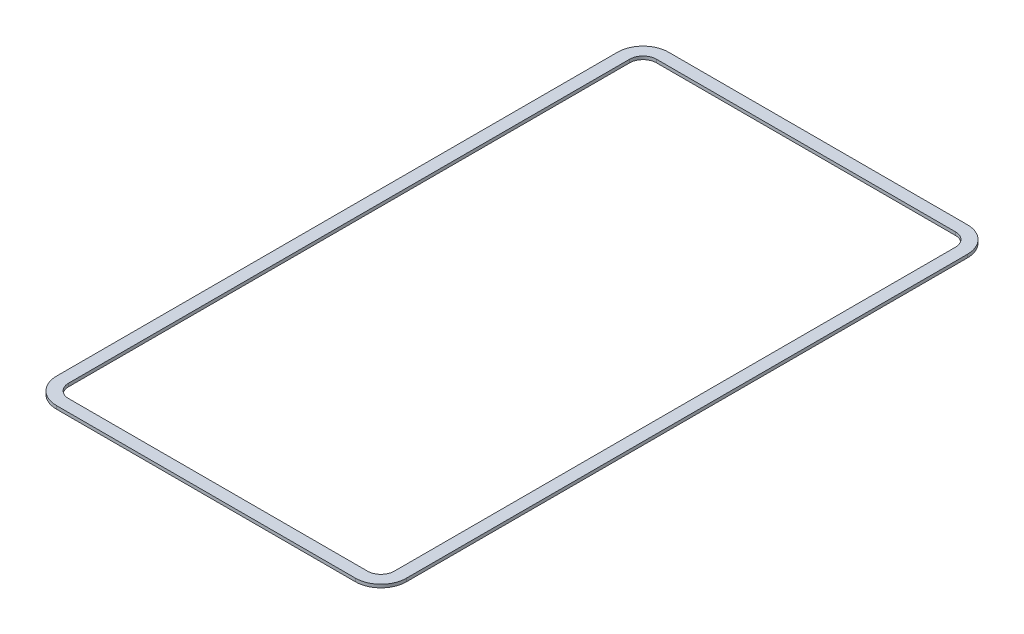
ISO-10303-21;
HEADER;
FILE_DESCRIPTION(('STEP AP214'),'2;1');
FILE_NAME('part.step','',(''),(''),'','','');
FILE_SCHEMA(('AUTOMOTIVE_DESIGN { 1 0 10303 214 1 1 1 1 }'));
ENDSEC;
DATA;
#1=APPLICATION_CONTEXT('core data for automotive mechanical design processes');
#2=APPLICATION_PROTOCOL_DEFINITION('international standard','automotive_design',2000,#1);
#3=PRODUCT_CONTEXT('',#1,'mechanical');
#4=PRODUCT('Part','Part','',(#3));
#5=PRODUCT_RELATED_PRODUCT_CATEGORY('part','',(#4));
#6=PRODUCT_DEFINITION_FORMATION('','',#4);
#7=PRODUCT_DEFINITION_CONTEXT('part definition',#1,'design');
#8=PRODUCT_DEFINITION('design','',#6,#7);
#9=PRODUCT_DEFINITION_SHAPE('','',#8);
#10=(LENGTH_UNIT() NAMED_UNIT(*) SI_UNIT(.MILLI.,.METRE.));
#11=(NAMED_UNIT(*) PLANE_ANGLE_UNIT() SI_UNIT($,.RADIAN.));
#12=(NAMED_UNIT(*) SI_UNIT($,.STERADIAN.) SOLID_ANGLE_UNIT());
#13=UNCERTAINTY_MEASURE_WITH_UNIT(LENGTH_MEASURE(1.E-05),#10,'distance_accuracy_value','');
#14=(GEOMETRIC_REPRESENTATION_CONTEXT(3) GLOBAL_UNCERTAINTY_ASSIGNED_CONTEXT((#13)) GLOBAL_UNIT_ASSIGNED_CONTEXT((#10,
#11,#12)) REPRESENTATION_CONTEXT('',''));
#15=CARTESIAN_POINT('',(0.,0.,0.));
#16=DIRECTION('',(0.,0.,1.));
#17=DIRECTION('',(1.,0.,0.));
#18=AXIS2_PLACEMENT_3D('',#15,#16,#17);
#19=CARTESIAN_POINT('',(-129.206151025171,0.5,16.495682613769));
#20=DIRECTION('',(0.,1.,0.));
#21=DIRECTION('',(0.,0.,1.));
#22=AXIS2_PLACEMENT_3D('',#19,#20,#21);
#23=PLANE('',#22);
#24=CARTESIAN_POINT('',(-129.206151025171,0.5,16.495682613769));
#25=DIRECTION('',(0.,1.,0.));
#26=DIRECTION('',(0.,0.,1.));
#27=AXIS2_PLACEMENT_3D('',#24,#25,#26);
#28=CIRCLE('',#27,4.);
#29=CARTESIAN_POINT('',(-133.206151025171,0.5,16.495682613769));
#30=VERTEX_POINT('',#29);
#31=CARTESIAN_POINT('',(-129.206151025171,0.5,20.495682613769));
#32=VERTEX_POINT('',#31);
#33=EDGE_CURVE('E217',#30,#32,#28,.T.);
#34=ORIENTED_EDGE('',*,*,#33,.T.);
#35=DIRECTION('',(1.,0.,0.));
#36=VECTOR('',#35,1.);
#37=CARTESIAN_POINT('',(-129.206151025171,0.5,20.495682613769));
#38=LINE('',#37,#36);
#39=CARTESIAN_POINT('',(-82.3199233679222,0.5,20.495682613769));
#40=VERTEX_POINT('',#39);
#41=EDGE_CURVE('E220',#32,#40,#38,.T.);
#42=ORIENTED_EDGE('',*,*,#41,.T.);
#43=CARTESIAN_POINT('',(-82.3199233679222,0.5,16.495682613769));
#44=DIRECTION('',(0.,1.,0.));
#45=DIRECTION('',(0.,0.,1.));
#46=AXIS2_PLACEMENT_3D('',#43,#44,#45);
#47=CIRCLE('',#46,3.99999999999999);
#48=CARTESIAN_POINT('',(-78.3199233679222,0.5,16.495682613769));
#49=VERTEX_POINT('',#48);
#50=EDGE_CURVE('E223',#40,#49,#47,.T.);
#51=ORIENTED_EDGE('',*,*,#50,.T.);
#52=DIRECTION('',(0.,0.,-1.));
#53=VECTOR('',#52,1.);
#54=CARTESIAN_POINT('',(-78.3199233679222,0.5,-71.5043173862311));
#55=LINE('',#54,#53);
#56=CARTESIAN_POINT('',(-78.3199233679222,0.5,-71.5043173862311));
#57=VERTEX_POINT('',#56);
#58=EDGE_CURVE('E225',#49,#57,#55,.T.);
#59=ORIENTED_EDGE('',*,*,#58,.T.);
#60=CARTESIAN_POINT('',(-82.3199233679222,0.5,-71.5043173862311));
#61=DIRECTION('',(0.,1.,0.));
#62=DIRECTION('',(0.,0.,-1.));
#63=AXIS2_PLACEMENT_3D('',#60,#61,#62);
#64=CIRCLE('',#63,4.);
#65=CARTESIAN_POINT('',(-82.3199233679222,0.5,-75.5043173862311));
#66=VERTEX_POINT('',#65);
#67=EDGE_CURVE('E227',#57,#66,#64,.T.);
#68=ORIENTED_EDGE('',*,*,#67,.T.);
#69=DIRECTION('',(-1.,0.,0.));
#70=VECTOR('',#69,1.);
#71=CARTESIAN_POINT('',(-129.206151025171,0.5,-75.5043173862311));
#72=LINE('',#71,#70);
#73=CARTESIAN_POINT('',(-129.206151025171,0.5,-75.5043173862311));
#74=VERTEX_POINT('',#73);
#75=EDGE_CURVE('E229',#66,#74,#72,.T.);
#76=ORIENTED_EDGE('',*,*,#75,.T.);
#77=CARTESIAN_POINT('',(-129.206151025171,0.5,-71.5043173862311));
#78=DIRECTION('',(0.,1.,0.));
#79=DIRECTION('',(0.,0.,1.));
#80=AXIS2_PLACEMENT_3D('',#77,#78,#79);
#81=CIRCLE('',#80,4.);
#82=CARTESIAN_POINT('',(-133.206151025171,0.5,-71.5043173862311));
#83=VERTEX_POINT('',#82);
#84=EDGE_CURVE('E231',#74,#83,#81,.T.);
#85=ORIENTED_EDGE('',*,*,#84,.T.);
#86=DIRECTION('',(0.,0.,1.));
#87=VECTOR('',#86,1.);
#88=CARTESIAN_POINT('',(-133.206151025171,0.5,-71.5043173862311));
#89=LINE('',#88,#87);
#90=EDGE_CURVE('E233',#83,#30,#89,.T.);
#91=ORIENTED_EDGE('',*,*,#90,.T.);
#92=EDGE_LOOP('',(#34,#42,#51,#59,#68,#76,#85,#91));
#93=FACE_BOUND('',#92,.T.);
#94=DIRECTION('',(0.,0.,1.));
#95=VECTOR('',#94,1.);
#96=CARTESIAN_POINT('',(-131.306151025171,0.5,-71.5043173862311));
#97=LINE('',#96,#95);
#98=CARTESIAN_POINT('',(-131.306151025171,0.5,-71.5043173862311));
#99=VERTEX_POINT('',#98);
#100=CARTESIAN_POINT('',(-131.306151025171,0.5,16.495682613769));
#101=VERTEX_POINT('',#100);
#102=EDGE_CURVE('E160',#99,#101,#97,.T.);
#103=ORIENTED_EDGE('',*,*,#102,.F.);
#104=CARTESIAN_POINT('',(-129.206151025171,0.5,-71.5043173862311));
#105=DIRECTION('',(0.,1.,0.));
#106=DIRECTION('',(0.,0.,1.));
#107=AXIS2_PLACEMENT_3D('',#104,#105,#106);
#108=CIRCLE('',#107,2.1);
#109=CARTESIAN_POINT('',(-129.206151025171,0.5,-73.604317386231));
#110=VERTEX_POINT('',#109);
#111=EDGE_CURVE('E152',#110,#99,#108,.T.);
#112=ORIENTED_EDGE('',*,*,#111,.F.);
#113=DIRECTION('',(-1.,0.,0.));
#114=VECTOR('',#113,1.);
#115=CARTESIAN_POINT('',(-129.206151025171,0.5,-73.604317386231));
#116=LINE('',#115,#114);
#117=CARTESIAN_POINT('',(-82.3199233679222,0.5,-73.604317386231));
#118=VERTEX_POINT('',#117);
#119=EDGE_CURVE('E185',#118,#110,#116,.T.);
#120=ORIENTED_EDGE('',*,*,#119,.F.);
#121=CARTESIAN_POINT('',(-82.3199233679222,0.5,-71.5043173862311));
#122=DIRECTION('',(0.,1.,0.));
#123=DIRECTION('',(0.,0.,-1.));
#124=AXIS2_PLACEMENT_3D('',#121,#122,#123);
#125=CIRCLE('',#124,2.09999999999999);
#126=CARTESIAN_POINT('',(-80.2199233679222,0.5,-71.5043173862311));
#127=VERTEX_POINT('',#126);
#128=EDGE_CURVE('E183',#127,#118,#125,.T.);
#129=ORIENTED_EDGE('',*,*,#128,.F.);
#130=DIRECTION('',(0.,0.,-1.));
#131=VECTOR('',#130,1.);
#132=CARTESIAN_POINT('',(-80.2199233679222,0.5,-71.5043173862311));
#133=LINE('',#132,#131);
#134=CARTESIAN_POINT('',(-80.2199233679222,0.5,16.495682613769));
#135=VERTEX_POINT('',#134);
#136=EDGE_CURVE('E181',#135,#127,#133,.T.);
#137=ORIENTED_EDGE('',*,*,#136,.F.);
#138=CARTESIAN_POINT('',(-82.3199233679222,0.5,16.495682613769));
#139=DIRECTION('',(0.,1.,0.));
#140=DIRECTION('',(0.,0.,1.));
#141=AXIS2_PLACEMENT_3D('',#138,#139,#140);
#142=CIRCLE('',#141,2.09999999999999);
#143=CARTESIAN_POINT('',(-82.3199233679222,0.5,18.595682613769));
#144=VERTEX_POINT('',#143);
#145=EDGE_CURVE('E179',#144,#135,#142,.T.);
#146=ORIENTED_EDGE('',*,*,#145,.F.);
#147=DIRECTION('',(1.,0.,0.));
#148=VECTOR('',#147,1.);
#149=CARTESIAN_POINT('',(-129.206151025171,0.5,18.595682613769));
#150=LINE('',#149,#148);
#151=CARTESIAN_POINT('',(-129.206151025171,0.5,18.595682613769));
#152=VERTEX_POINT('',#151);
#153=EDGE_CURVE('E175',#152,#144,#150,.T.);
#154=ORIENTED_EDGE('',*,*,#153,.F.);
#155=CARTESIAN_POINT('',(-129.206151025171,0.5,16.495682613769));
#156=DIRECTION('',(0.,1.,0.));
#157=DIRECTION('',(0.,0.,1.));
#158=AXIS2_PLACEMENT_3D('',#155,#156,#157);
#159=CIRCLE('',#158,2.10000000000001);
#160=EDGE_CURVE('E173',#101,#152,#159,.T.);
#161=ORIENTED_EDGE('',*,*,#160,.F.);
#162=EDGE_LOOP('',(#103,#112,#120,#129,#137,#146,#154,#161));
#163=FACE_BOUND('',#162,.T.);
#164=ADVANCED_FACE('F39',(#93,#163),#23,.T.);
#165=CARTESIAN_POINT('',(-129.206151025171,0.,16.495682613769));
#166=DIRECTION('',(0.,1.,0.));
#167=DIRECTION('',(0.,0.,1.));
#168=AXIS2_PLACEMENT_3D('',#165,#166,#167);
#169=PLANE('',#168);
#170=CARTESIAN_POINT('',(-129.206151025171,0.,16.495682613769));
#171=DIRECTION('',(0.,1.,0.));
#172=DIRECTION('',(0.,0.,1.));
#173=AXIS2_PLACEMENT_3D('',#170,#171,#172);
#174=CIRCLE('',#173,4.);
#175=CARTESIAN_POINT('',(-133.206151025171,0.,16.495682613769));
#176=VERTEX_POINT('',#175);
#177=CARTESIAN_POINT('',(-129.206151025171,0.,20.495682613769));
#178=VERTEX_POINT('',#177);
#179=EDGE_CURVE('E168',#176,#178,#174,.T.);
#180=ORIENTED_EDGE('',*,*,#179,.F.);
#181=DIRECTION('',(0.,0.,1.));
#182=VECTOR('',#181,1.);
#183=CARTESIAN_POINT('',(-133.206151025171,0.,-71.5043173862311));
#184=LINE('',#183,#182);
#185=CARTESIAN_POINT('',(-133.206151025171,0.,-71.5043173862311));
#186=VERTEX_POINT('',#185);
#187=EDGE_CURVE('E221',#186,#176,#184,.T.);
#188=ORIENTED_EDGE('',*,*,#187,.F.);
#189=CARTESIAN_POINT('',(-129.206151025171,0.,-71.5043173862311));
#190=DIRECTION('',(0.,1.,0.));
#191=DIRECTION('',(0.,0.,1.));
#192=AXIS2_PLACEMENT_3D('',#189,#190,#191);
#193=CIRCLE('',#192,4.);
#194=CARTESIAN_POINT('',(-129.206151025171,0.,-75.5043173862311));
#195=VERTEX_POINT('',#194);
#196=EDGE_CURVE('E248',#195,#186,#193,.T.);
#197=ORIENTED_EDGE('',*,*,#196,.F.);
#198=DIRECTION('',(-1.,0.,0.));
#199=VECTOR('',#198,1.);
#200=CARTESIAN_POINT('',(-129.206151025171,0.,-75.5043173862311));
#201=LINE('',#200,#199);
#202=CARTESIAN_POINT('',(-82.3199233679222,0.,-75.5043173862311));
#203=VERTEX_POINT('',#202);
#204=EDGE_CURVE('E246',#203,#195,#201,.T.);
#205=ORIENTED_EDGE('',*,*,#204,.F.);
#206=CARTESIAN_POINT('',(-82.3199233679222,0.,-71.5043173862311));
#207=DIRECTION('',(0.,1.,0.));
#208=DIRECTION('',(0.,0.,-1.));
#209=AXIS2_PLACEMENT_3D('',#206,#207,#208);
#210=CIRCLE('',#209,4.);
#211=CARTESIAN_POINT('',(-78.3199233679222,0.,-71.5043173862311));
#212=VERTEX_POINT('',#211);
#213=EDGE_CURVE('E244',#212,#203,#210,.T.);
#214=ORIENTED_EDGE('',*,*,#213,.F.);
#215=DIRECTION('',(0.,0.,-1.));
#216=VECTOR('',#215,1.);
#217=CARTESIAN_POINT('',(-78.3199233679222,0.,-71.5043173862311));
#218=LINE('',#217,#216);
#219=CARTESIAN_POINT('',(-78.3199233679222,0.,16.495682613769));
#220=VERTEX_POINT('',#219);
#221=EDGE_CURVE('E242',#220,#212,#218,.T.);
#222=ORIENTED_EDGE('',*,*,#221,.F.);
#223=CARTESIAN_POINT('',(-82.3199233679222,0.,16.495682613769));
#224=DIRECTION('',(0.,1.,0.));
#225=DIRECTION('',(0.,0.,1.));
#226=AXIS2_PLACEMENT_3D('',#223,#224,#225);
#227=CIRCLE('',#226,3.99999999999999);
#228=CARTESIAN_POINT('',(-82.3199233679222,0.,20.495682613769));
#229=VERTEX_POINT('',#228);
#230=EDGE_CURVE('E240',#229,#220,#227,.T.);
#231=ORIENTED_EDGE('',*,*,#230,.F.);
#232=DIRECTION('',(1.,0.,0.));
#233=VECTOR('',#232,1.);
#234=CARTESIAN_POINT('',(-129.206151025171,0.,20.495682613769));
#235=LINE('',#234,#233);
#236=EDGE_CURVE('E238',#178,#229,#235,.T.);
#237=ORIENTED_EDGE('',*,*,#236,.F.);
#238=EDGE_LOOP('',(#180,#188,#197,#205,#214,#222,#231,#237));
#239=FACE_BOUND('',#238,.T.);
#240=CARTESIAN_POINT('',(-129.206151025171,0.,-71.5043173862311));
#241=DIRECTION('',(0.,1.,0.));
#242=DIRECTION('',(0.,0.,1.));
#243=AXIS2_PLACEMENT_3D('',#240,#241,#242);
#244=CIRCLE('',#243,2.1);
#245=CARTESIAN_POINT('',(-129.206151025171,0.,-73.604317386231));
#246=VERTEX_POINT('',#245);
#247=CARTESIAN_POINT('',(-131.306151025171,0.,-71.5043173862311));
#248=VERTEX_POINT('',#247);
#249=EDGE_CURVE('E62',#246,#248,#244,.T.);
#250=ORIENTED_EDGE('',*,*,#249,.T.);
#251=DIRECTION('',(0.,0.,1.));
#252=VECTOR('',#251,1.);
#253=CARTESIAN_POINT('',(-131.306151025171,0.,-71.5043173862311));
#254=LINE('',#253,#252);
#255=CARTESIAN_POINT('',(-131.306151025171,0.,16.495682613769));
#256=VERTEX_POINT('',#255);
#257=EDGE_CURVE('E167',#248,#256,#254,.T.);
#258=ORIENTED_EDGE('',*,*,#257,.T.);
#259=CARTESIAN_POINT('',(-129.206151025171,0.,16.495682613769));
#260=DIRECTION('',(0.,1.,0.));
#261=DIRECTION('',(0.,0.,1.));
#262=AXIS2_PLACEMENT_3D('',#259,#260,#261);
#263=CIRCLE('',#262,2.10000000000001);
#264=CARTESIAN_POINT('',(-129.206151025171,0.,18.595682613769));
#265=VERTEX_POINT('',#264);
#266=EDGE_CURVE('E189',#256,#265,#263,.T.);
#267=ORIENTED_EDGE('',*,*,#266,.T.);
#268=DIRECTION('',(1.,0.,0.));
#269=VECTOR('',#268,1.);
#270=CARTESIAN_POINT('',(-129.206151025171,0.,18.595682613769));
#271=LINE('',#270,#269);
#272=CARTESIAN_POINT('',(-82.3199233679222,0.,18.595682613769));
#273=VERTEX_POINT('',#272);
#274=EDGE_CURVE('E192',#265,#273,#271,.T.);
#275=ORIENTED_EDGE('',*,*,#274,.T.);
#276=CARTESIAN_POINT('',(-82.3199233679222,0.,16.495682613769));
#277=DIRECTION('',(0.,1.,0.));
#278=DIRECTION('',(0.,0.,1.));
#279=AXIS2_PLACEMENT_3D('',#276,#277,#278);
#280=CIRCLE('',#279,2.09999999999999);
#281=CARTESIAN_POINT('',(-80.2199233679222,0.,16.495682613769));
#282=VERTEX_POINT('',#281);
#283=EDGE_CURVE('E195',#273,#282,#280,.T.);
#284=ORIENTED_EDGE('',*,*,#283,.T.);
#285=DIRECTION('',(0.,0.,-1.));
#286=VECTOR('',#285,1.);
#287=CARTESIAN_POINT('',(-80.2199233679222,0.,-71.5043173862311));
#288=LINE('',#287,#286);
#289=CARTESIAN_POINT('',(-80.2199233679222,0.,-71.5043173862311));
#290=VERTEX_POINT('',#289);
#291=EDGE_CURVE('E198',#282,#290,#288,.T.);
#292=ORIENTED_EDGE('',*,*,#291,.T.);
#293=CARTESIAN_POINT('',(-82.3199233679222,0.,-71.5043173862311));
#294=DIRECTION('',(0.,1.,0.));
#295=DIRECTION('',(0.,0.,-1.));
#296=AXIS2_PLACEMENT_3D('',#293,#294,#295);
#297=CIRCLE('',#296,2.09999999999999);
#298=CARTESIAN_POINT('',(-82.3199233679222,0.,-73.604317386231));
#299=VERTEX_POINT('',#298);
#300=EDGE_CURVE('E201',#290,#299,#297,.T.);
#301=ORIENTED_EDGE('',*,*,#300,.T.);
#302=DIRECTION('',(-1.,0.,0.));
#303=VECTOR('',#302,1.);
#304=CARTESIAN_POINT('',(-129.206151025171,0.,-73.604317386231));
#305=LINE('',#304,#303);
#306=EDGE_CURVE('E161',#299,#246,#305,.T.);
#307=ORIENTED_EDGE('',*,*,#306,.T.);
#308=EDGE_LOOP('',(#250,#258,#267,#275,#284,#292,#301,#307));
#309=FACE_BOUND('',#308,.T.);
#310=ADVANCED_FACE('F278',(#239,#309),#169,.F.);
#311=CARTESIAN_POINT('',(-129.206151025171,0.5,16.495682613769));
#312=DIRECTION('',(0.,-1.,0.));
#313=DIRECTION('',(0.,0.,-1.));
#314=AXIS2_PLACEMENT_3D('',#311,#312,#313);
#315=CYLINDRICAL_SURFACE('',#314,4.);
#316=ORIENTED_EDGE('',*,*,#179,.T.);
#317=DIRECTION('',(0.,-1.,0.));
#318=VECTOR('',#317,1.);
#319=CARTESIAN_POINT('',(-129.206151025171,0.5,20.495682613769));
#320=LINE('',#319,#318);
#321=EDGE_CURVE('E11',#32,#178,#320,.T.);
#322=ORIENTED_EDGE('',*,*,#321,.F.);
#323=ORIENTED_EDGE('',*,*,#33,.F.);
#324=DIRECTION('',(0.,-1.,0.));
#325=VECTOR('',#324,1.);
#326=CARTESIAN_POINT('',(-133.206151025171,0.5,16.495682613769));
#327=LINE('',#326,#325);
#328=EDGE_CURVE('E235',#30,#176,#327,.T.);
#329=ORIENTED_EDGE('',*,*,#328,.T.);
#330=EDGE_LOOP('',(#316,#322,#323,#329));
#331=FACE_BOUND('',#330,.T.);
#332=ADVANCED_FACE('F41',(#331),#315,.T.);
#333=CARTESIAN_POINT('',(-129.206151025171,0.5,20.495682613769));
#334=DIRECTION('',(0.,0.,-1.));
#335=DIRECTION('',(-1.,0.,0.));
#336=AXIS2_PLACEMENT_3D('',#333,#334,#335);
#337=PLANE('',#336);
#338=ORIENTED_EDGE('',*,*,#236,.T.);
#339=DIRECTION('',(0.,-1.,0.));
#340=VECTOR('',#339,1.);
#341=CARTESIAN_POINT('',(-82.3199233679222,0.5,20.495682613769));
#342=LINE('',#341,#340);
#343=EDGE_CURVE('E47',#40,#229,#342,.T.);
#344=ORIENTED_EDGE('',*,*,#343,.F.);
#345=ORIENTED_EDGE('',*,*,#41,.F.);
#346=ORIENTED_EDGE('',*,*,#321,.T.);
#347=EDGE_LOOP('',(#338,#344,#345,#346));
#348=FACE_BOUND('',#347,.T.);
#349=ADVANCED_FACE('F295',(#348),#337,.F.);
#350=CARTESIAN_POINT('',(-82.3199233679222,0.5,16.495682613769));
#351=DIRECTION('',(0.,-1.,0.));
#352=DIRECTION('',(0.,0.,-1.));
#353=AXIS2_PLACEMENT_3D('',#350,#351,#352);
#354=CYLINDRICAL_SURFACE('',#353,3.99999999999999);
#355=ORIENTED_EDGE('',*,*,#230,.T.);
#356=DIRECTION('',(0.,-1.,0.));
#357=VECTOR('',#356,1.);
#358=CARTESIAN_POINT('',(-78.3199233679222,0.5,16.495682613769));
#359=LINE('',#358,#357);
#360=EDGE_CURVE('E265',#49,#220,#359,.T.);
#361=ORIENTED_EDGE('',*,*,#360,.F.);
#362=ORIENTED_EDGE('',*,*,#50,.F.);
#363=ORIENTED_EDGE('',*,*,#343,.T.);
#364=EDGE_LOOP('',(#355,#361,#362,#363));
#365=FACE_BOUND('',#364,.T.);
#366=ADVANCED_FACE('F272',(#365),#354,.T.);
#367=CARTESIAN_POINT('',(-78.3199233679222,0.5,-71.5043173862311));
#368=DIRECTION('',(-1.,0.,0.));
#369=DIRECTION('',(0.,0.,1.));
#370=AXIS2_PLACEMENT_3D('',#367,#368,#369);
#371=PLANE('',#370);
#372=ORIENTED_EDGE('',*,*,#221,.T.);
#373=DIRECTION('',(0.,-1.,0.));
#374=VECTOR('',#373,1.);
#375=CARTESIAN_POINT('',(-78.3199233679222,0.5,-71.5043173862311));
#376=LINE('',#375,#374);
#377=EDGE_CURVE('E262',#57,#212,#376,.T.);
#378=ORIENTED_EDGE('',*,*,#377,.F.);
#379=ORIENTED_EDGE('',*,*,#58,.F.);
#380=ORIENTED_EDGE('',*,*,#360,.T.);
#381=EDGE_LOOP('',(#372,#378,#379,#380));
#382=FACE_BOUND('',#381,.T.);
#383=ADVANCED_FACE('F284',(#382),#371,.F.);
#384=CARTESIAN_POINT('',(-82.3199233679222,0.5,-71.5043173862311));
#385=DIRECTION('',(0.,-1.,0.));
#386=DIRECTION('',(0.,0.,-1.));
#387=AXIS2_PLACEMENT_3D('',#384,#385,#386);
#388=CYLINDRICAL_SURFACE('',#387,4.);
#389=ORIENTED_EDGE('',*,*,#213,.T.);
#390=DIRECTION('',(0.,-1.,0.));
#391=VECTOR('',#390,1.);
#392=CARTESIAN_POINT('',(-82.3199233679222,0.5,-75.5043173862311));
#393=LINE('',#392,#391);
#394=EDGE_CURVE('E259',#66,#203,#393,.T.);
#395=ORIENTED_EDGE('',*,*,#394,.F.);
#396=ORIENTED_EDGE('',*,*,#67,.F.);
#397=ORIENTED_EDGE('',*,*,#377,.T.);
#398=EDGE_LOOP('',(#389,#395,#396,#397));
#399=FACE_BOUND('',#398,.T.);
#400=ADVANCED_FACE('F288',(#399),#388,.T.);
#401=CARTESIAN_POINT('',(-129.206151025171,0.5,-75.5043173862311));
#402=DIRECTION('',(0.,0.,1.));
#403=DIRECTION('',(1.,0.,0.));
#404=AXIS2_PLACEMENT_3D('',#401,#402,#403);
#405=PLANE('',#404);
#406=ORIENTED_EDGE('',*,*,#204,.T.);
#407=DIRECTION('',(0.,-1.,0.));
#408=VECTOR('',#407,1.);
#409=CARTESIAN_POINT('',(-129.206151025171,0.5,-75.5043173862311));
#410=LINE('',#409,#408);
#411=EDGE_CURVE('E256',#74,#195,#410,.T.);
#412=ORIENTED_EDGE('',*,*,#411,.F.);
#413=ORIENTED_EDGE('',*,*,#75,.F.);
#414=ORIENTED_EDGE('',*,*,#394,.T.);
#415=EDGE_LOOP('',(#406,#412,#413,#414));
#416=FACE_BOUND('',#415,.T.);
#417=ADVANCED_FACE('F308',(#416),#405,.F.);
#418=CARTESIAN_POINT('',(-129.206151025171,0.5,-71.5043173862311));
#419=DIRECTION('',(0.,-1.,0.));
#420=DIRECTION('',(0.,0.,-1.));
#421=AXIS2_PLACEMENT_3D('',#418,#419,#420);
#422=CYLINDRICAL_SURFACE('',#421,4.);
#423=ORIENTED_EDGE('',*,*,#196,.T.);
#424=DIRECTION('',(0.,-1.,0.));
#425=VECTOR('',#424,1.);
#426=CARTESIAN_POINT('',(-133.206151025171,0.5,-71.5043173862311));
#427=LINE('',#426,#425);
#428=EDGE_CURVE('E253',#83,#186,#427,.T.);
#429=ORIENTED_EDGE('',*,*,#428,.F.);
#430=ORIENTED_EDGE('',*,*,#84,.F.);
#431=ORIENTED_EDGE('',*,*,#411,.T.);
#432=EDGE_LOOP('',(#423,#429,#430,#431));
#433=FACE_BOUND('',#432,.T.);
#434=ADVANCED_FACE('F306',(#433),#422,.T.);
#435=CARTESIAN_POINT('',(-133.206151025171,0.5,-71.5043173862311));
#436=DIRECTION('',(1.,0.,0.));
#437=DIRECTION('',(0.,0.,-1.));
#438=AXIS2_PLACEMENT_3D('',#435,#436,#437);
#439=PLANE('',#438);
#440=ORIENTED_EDGE('',*,*,#187,.T.);
#441=ORIENTED_EDGE('',*,*,#328,.F.);
#442=ORIENTED_EDGE('',*,*,#90,.F.);
#443=ORIENTED_EDGE('',*,*,#428,.T.);
#444=EDGE_LOOP('',(#440,#441,#442,#443));
#445=FACE_BOUND('',#444,.T.);
#446=ADVANCED_FACE('F301',(#445),#439,.F.);
#447=CARTESIAN_POINT('',(-129.206151025171,0.5,-71.5043173862311));
#448=DIRECTION('',(0.,-1.,0.));
#449=DIRECTION('',(0.,0.,-1.));
#450=AXIS2_PLACEMENT_3D('',#447,#448,#449);
#451=CYLINDRICAL_SURFACE('',#450,2.1);
#452=ORIENTED_EDGE('',*,*,#249,.F.);
#453=DIRECTION('',(0.,-1.,0.));
#454=VECTOR('',#453,1.);
#455=CARTESIAN_POINT('',(-129.206151025171,0.5,-73.604317386231));
#456=LINE('',#455,#454);
#457=EDGE_CURVE('E156',#110,#246,#456,.T.);
#458=ORIENTED_EDGE('',*,*,#457,.F.);
#459=ORIENTED_EDGE('',*,*,#111,.T.);
#460=DIRECTION('',(0.,-1.,0.));
#461=VECTOR('',#460,1.);
#462=CARTESIAN_POINT('',(-131.306151025171,0.5,-71.5043173862311));
#463=LINE('',#462,#461);
#464=EDGE_CURVE('E155',#99,#248,#463,.T.);
#465=ORIENTED_EDGE('',*,*,#464,.T.);
#466=EDGE_LOOP('',(#452,#458,#459,#465));
#467=FACE_BOUND('',#466,.T.);
#468=ADVANCED_FACE('F154',(#467),#451,.F.);
#469=CARTESIAN_POINT('',(-131.306151025171,0.5,-71.5043173862311));
#470=DIRECTION('',(1.,0.,0.));
#471=DIRECTION('',(0.,0.,-1.));
#472=AXIS2_PLACEMENT_3D('',#469,#470,#471);
#473=PLANE('',#472);
#474=ORIENTED_EDGE('',*,*,#257,.F.);
#475=ORIENTED_EDGE('',*,*,#464,.F.);
#476=ORIENTED_EDGE('',*,*,#102,.T.);
#477=DIRECTION('',(0.,-1.,0.));
#478=VECTOR('',#477,1.);
#479=CARTESIAN_POINT('',(-131.306151025171,0.5,16.495682613769));
#480=LINE('',#479,#478);
#481=EDGE_CURVE('E169',#101,#256,#480,.T.);
#482=ORIENTED_EDGE('',*,*,#481,.T.);
#483=EDGE_LOOP('',(#474,#475,#476,#482));
#484=FACE_BOUND('',#483,.T.);
#485=ADVANCED_FACE('F164',(#484),#473,.T.);
#486=CARTESIAN_POINT('',(-129.206151025171,0.5,16.495682613769));
#487=DIRECTION('',(0.,-1.,0.));
#488=DIRECTION('',(0.,0.,-1.));
#489=AXIS2_PLACEMENT_3D('',#486,#487,#488);
#490=CYLINDRICAL_SURFACE('',#489,2.10000000000001);
#491=ORIENTED_EDGE('',*,*,#266,.F.);
#492=ORIENTED_EDGE('',*,*,#481,.F.);
#493=ORIENTED_EDGE('',*,*,#160,.T.);
#494=DIRECTION('',(0.,-1.,0.));
#495=VECTOR('',#494,1.);
#496=CARTESIAN_POINT('',(-129.206151025171,0.5,18.595682613769));
#497=LINE('',#496,#495);
#498=EDGE_CURVE('E214',#152,#265,#497,.T.);
#499=ORIENTED_EDGE('',*,*,#498,.T.);
#500=EDGE_LOOP('',(#491,#492,#493,#499));
#501=FACE_BOUND('',#500,.T.);
#502=ADVANCED_FACE('F333',(#501),#490,.F.);
#503=CARTESIAN_POINT('',(-129.206151025171,0.5,18.595682613769));
#504=DIRECTION('',(0.,0.,-1.));
#505=DIRECTION('',(-1.,0.,0.));
#506=AXIS2_PLACEMENT_3D('',#503,#504,#505);
#507=PLANE('',#506);
#508=ORIENTED_EDGE('',*,*,#274,.F.);
#509=ORIENTED_EDGE('',*,*,#498,.F.);
#510=ORIENTED_EDGE('',*,*,#153,.T.);
#511=DIRECTION('',(0.,-1.,0.));
#512=VECTOR('',#511,1.);
#513=CARTESIAN_POINT('',(-82.3199233679222,0.5,18.595682613769));
#514=LINE('',#513,#512);
#515=EDGE_CURVE('E212',#144,#273,#514,.T.);
#516=ORIENTED_EDGE('',*,*,#515,.T.);
#517=EDGE_LOOP('',(#508,#509,#510,#516));
#518=FACE_BOUND('',#517,.T.);
#519=ADVANCED_FACE('F337',(#518),#507,.T.);
#520=CARTESIAN_POINT('',(-82.3199233679222,0.5,16.495682613769));
#521=DIRECTION('',(0.,-1.,0.));
#522=DIRECTION('',(0.,0.,-1.));
#523=AXIS2_PLACEMENT_3D('',#520,#521,#522);
#524=CYLINDRICAL_SURFACE('',#523,2.09999999999999);
#525=ORIENTED_EDGE('',*,*,#283,.F.);
#526=ORIENTED_EDGE('',*,*,#515,.F.);
#527=ORIENTED_EDGE('',*,*,#145,.T.);
#528=DIRECTION('',(0.,-1.,0.));
#529=VECTOR('',#528,1.);
#530=CARTESIAN_POINT('',(-80.2199233679222,0.5,16.495682613769));
#531=LINE('',#530,#529);
#532=EDGE_CURVE('E210',#135,#282,#531,.T.);
#533=ORIENTED_EDGE('',*,*,#532,.T.);
#534=EDGE_LOOP('',(#525,#526,#527,#533));
#535=FACE_BOUND('',#534,.T.);
#536=ADVANCED_FACE('F343',(#535),#524,.F.);
#537=CARTESIAN_POINT('',(-80.2199233679222,0.5,-71.5043173862311));
#538=DIRECTION('',(-1.,0.,0.));
#539=DIRECTION('',(0.,0.,1.));
#540=AXIS2_PLACEMENT_3D('',#537,#538,#539);
#541=PLANE('',#540);
#542=ORIENTED_EDGE('',*,*,#291,.F.);
#543=ORIENTED_EDGE('',*,*,#532,.F.);
#544=ORIENTED_EDGE('',*,*,#136,.T.);
#545=DIRECTION('',(0.,-1.,0.));
#546=VECTOR('',#545,1.);
#547=CARTESIAN_POINT('',(-80.2199233679222,0.5,-71.5043173862311));
#548=LINE('',#547,#546);
#549=EDGE_CURVE('E208',#127,#290,#548,.T.);
#550=ORIENTED_EDGE('',*,*,#549,.T.);
#551=EDGE_LOOP('',(#542,#543,#544,#550));
#552=FACE_BOUND('',#551,.T.);
#553=ADVANCED_FACE('F347',(#552),#541,.T.);
#554=CARTESIAN_POINT('',(-82.3199233679222,0.5,-71.5043173862311));
#555=DIRECTION('',(0.,-1.,0.));
#556=DIRECTION('',(0.,0.,-1.));
#557=AXIS2_PLACEMENT_3D('',#554,#555,#556);
#558=CYLINDRICAL_SURFACE('',#557,2.09999999999999);
#559=ORIENTED_EDGE('',*,*,#300,.F.);
#560=ORIENTED_EDGE('',*,*,#549,.F.);
#561=ORIENTED_EDGE('',*,*,#128,.T.);
#562=DIRECTION('',(0.,-1.,0.));
#563=VECTOR('',#562,1.);
#564=CARTESIAN_POINT('',(-82.3199233679222,0.5,-73.604317386231));
#565=LINE('',#564,#563);
#566=EDGE_CURVE('E54',#118,#299,#565,.T.);
#567=ORIENTED_EDGE('',*,*,#566,.T.);
#568=EDGE_LOOP('',(#559,#560,#561,#567));
#569=FACE_BOUND('',#568,.T.);
#570=ADVANCED_FACE('F351',(#569),#558,.F.);
#571=CARTESIAN_POINT('',(-129.206151025171,0.5,-73.604317386231));
#572=DIRECTION('',(0.,0.,1.));
#573=DIRECTION('',(1.,0.,0.));
#574=AXIS2_PLACEMENT_3D('',#571,#572,#573);
#575=PLANE('',#574);
#576=ORIENTED_EDGE('',*,*,#306,.F.);
#577=ORIENTED_EDGE('',*,*,#566,.F.);
#578=ORIENTED_EDGE('',*,*,#119,.T.);
#579=ORIENTED_EDGE('',*,*,#457,.T.);
#580=EDGE_LOOP('',(#576,#577,#578,#579));
#581=FACE_BOUND('',#580,.T.);
#582=ADVANCED_FACE('F355',(#581),#575,.T.);
#583=CLOSED_SHELL('',(#164,#310,#332,#349,#366,#383,#400,#417,#434,#446,#468,#485,#502,#519,
#536,#553,#570,#582));
#584=MANIFOLD_SOLID_BREP('B2',#583);
#585=ADVANCED_BREP_SHAPE_REPRESENTATION('',(#18,#584),#14);
#586=SHAPE_DEFINITION_REPRESENTATION(#9,#585);
ENDSEC;
END-ISO-10303-21;
